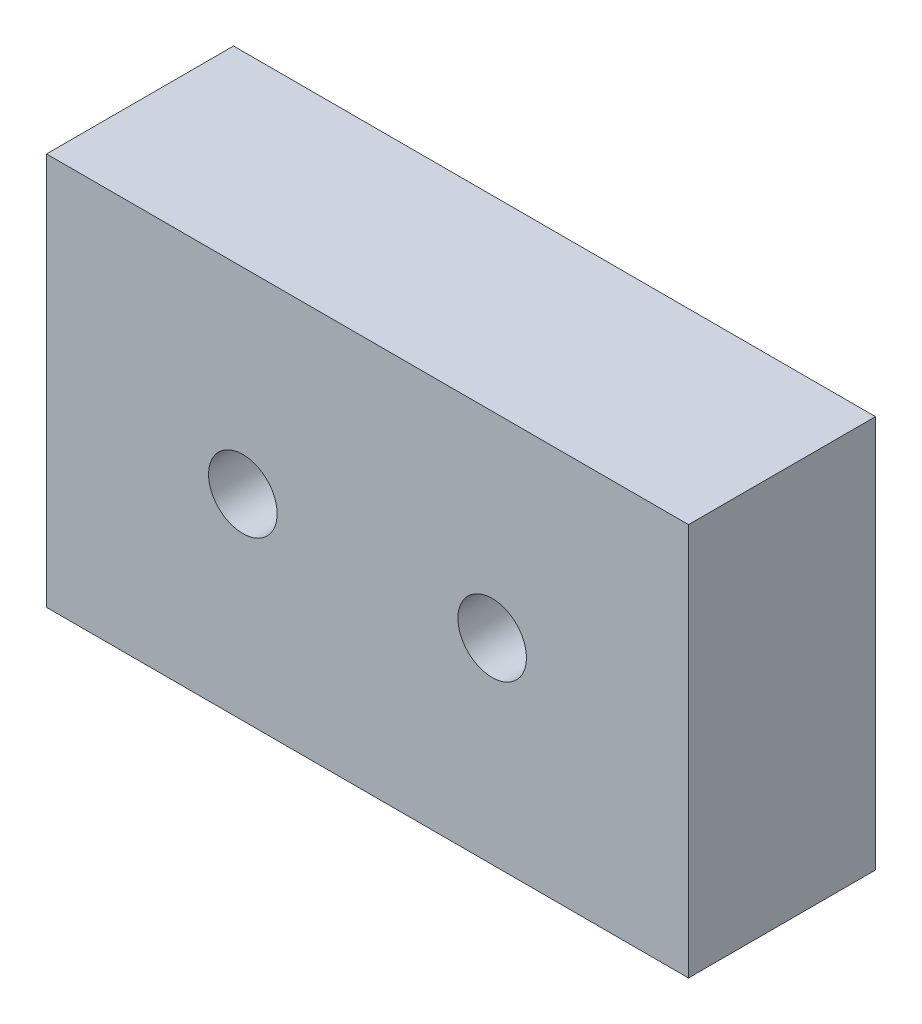
ISO-10303-21;
HEADER;
FILE_DESCRIPTION(('STEP AP214'),'2;1');
FILE_NAME('part.step','',(''),(''),'','','');
FILE_SCHEMA(('AUTOMOTIVE_DESIGN { 1 0 10303 214 1 1 1 1 }'));
ENDSEC;
DATA;
#1=APPLICATION_CONTEXT('core data for automotive mechanical design processes');
#2=APPLICATION_PROTOCOL_DEFINITION('international standard','automotive_design',2000,#1);
#3=PRODUCT_CONTEXT('',#1,'mechanical');
#4=PRODUCT('Part','Part','',(#3));
#5=PRODUCT_RELATED_PRODUCT_CATEGORY('part','',(#4));
#6=PRODUCT_DEFINITION_FORMATION('','',#4);
#7=PRODUCT_DEFINITION_CONTEXT('part definition',#1,'design');
#8=PRODUCT_DEFINITION('design','',#6,#7);
#9=PRODUCT_DEFINITION_SHAPE('','',#8);
#10=(LENGTH_UNIT() NAMED_UNIT(*) SI_UNIT(.MILLI.,.METRE.));
#11=(NAMED_UNIT(*) PLANE_ANGLE_UNIT() SI_UNIT($,.RADIAN.));
#12=(NAMED_UNIT(*) SI_UNIT($,.STERADIAN.) SOLID_ANGLE_UNIT());
#13=UNCERTAINTY_MEASURE_WITH_UNIT(LENGTH_MEASURE(1.E-05),#10,'distance_accuracy_value','');
#14=(GEOMETRIC_REPRESENTATION_CONTEXT(3) GLOBAL_UNCERTAINTY_ASSIGNED_CONTEXT((#13)) GLOBAL_UNIT_ASSIGNED_CONTEXT((#10,
#11,#12)) REPRESENTATION_CONTEXT('',''));
#15=CARTESIAN_POINT('',(0.,0.,0.));
#16=DIRECTION('',(0.,0.,1.));
#17=DIRECTION('',(1.,0.,0.));
#18=AXIS2_PLACEMENT_3D('',#15,#16,#17);
#19=CARTESIAN_POINT('',(20.6,12.6,12.));
#20=DIRECTION('',(-1.,0.,0.));
#21=DIRECTION('',(0.,-1.,0.));
#22=AXIS2_PLACEMENT_3D('',#19,#20,#21);
#23=PLANE('',#22);
#24=DIRECTION('',(0.,1.,0.));
#25=VECTOR('',#24,1.);
#26=CARTESIAN_POINT('',(20.6,12.6,0.));
#27=LINE('',#26,#25);
#28=CARTESIAN_POINT('',(20.6,-12.6,0.));
#29=VERTEX_POINT('',#28);
#30=CARTESIAN_POINT('',(20.6,12.6,0.));
#31=VERTEX_POINT('',#30);
#32=EDGE_CURVE('E95',#29,#31,#27,.T.);
#33=ORIENTED_EDGE('',*,*,#32,.T.);
#34=DIRECTION('',(0.,0.,-1.));
#35=VECTOR('',#34,1.);
#36=CARTESIAN_POINT('',(20.6,12.6,12.));
#37=LINE('',#36,#35);
#38=CARTESIAN_POINT('',(20.6,12.6,12.));
#39=VERTEX_POINT('',#38);
#40=EDGE_CURVE('E11',#39,#31,#37,.T.);
#41=ORIENTED_EDGE('',*,*,#40,.F.);
#42=DIRECTION('',(0.,1.,0.));
#43=VECTOR('',#42,1.);
#44=CARTESIAN_POINT('',(20.6,12.6,12.));
#45=LINE('',#44,#43);
#46=CARTESIAN_POINT('',(20.6,-12.6,12.));
#47=VERTEX_POINT('',#46);
#48=EDGE_CURVE('E83',#47,#39,#45,.T.);
#49=ORIENTED_EDGE('',*,*,#48,.F.);
#50=DIRECTION('',(0.,0.,-1.));
#51=VECTOR('',#50,1.);
#52=CARTESIAN_POINT('',(20.6,-12.6,12.));
#53=LINE('',#52,#51);
#54=EDGE_CURVE('E91',#47,#29,#53,.T.);
#55=ORIENTED_EDGE('',*,*,#54,.T.);
#56=EDGE_LOOP('',(#33,#41,#49,#55));
#57=FACE_BOUND('',#56,.T.);
#58=ADVANCED_FACE('F32',(#57),#23,.F.);
#59=CARTESIAN_POINT('',(-20.6,12.6,12.));
#60=DIRECTION('',(0.,-1.,0.));
#61=DIRECTION('',(0.,0.,-1.));
#62=AXIS2_PLACEMENT_3D('',#59,#60,#61);
#63=PLANE('',#62);
#64=DIRECTION('',(-1.,0.,0.));
#65=VECTOR('',#64,1.);
#66=CARTESIAN_POINT('',(-20.6,12.6,0.));
#67=LINE('',#66,#65);
#68=CARTESIAN_POINT('',(-20.6,12.6,0.));
#69=VERTEX_POINT('',#68);
#70=EDGE_CURVE('E87',#31,#69,#67,.T.);
#71=ORIENTED_EDGE('',*,*,#70,.T.);
#72=DIRECTION('',(0.,0.,-1.));
#73=VECTOR('',#72,1.);
#74=CARTESIAN_POINT('',(-20.6,12.6,12.));
#75=LINE('',#74,#73);
#76=CARTESIAN_POINT('',(-20.6,12.6,12.));
#77=VERTEX_POINT('',#76);
#78=EDGE_CURVE('E40',#77,#69,#75,.T.);
#79=ORIENTED_EDGE('',*,*,#78,.F.);
#80=DIRECTION('',(-1.,0.,0.));
#81=VECTOR('',#80,1.);
#82=CARTESIAN_POINT('',(-20.6,12.6,12.));
#83=LINE('',#82,#81);
#84=EDGE_CURVE('E78',#39,#77,#83,.T.);
#85=ORIENTED_EDGE('',*,*,#84,.F.);
#86=ORIENTED_EDGE('',*,*,#40,.T.);
#87=EDGE_LOOP('',(#71,#79,#85,#86));
#88=FACE_BOUND('',#87,.T.);
#89=ADVANCED_FACE('F86',(#88),#63,.F.);
#90=CARTESIAN_POINT('',(-20.6,12.6,12.));
#91=DIRECTION('',(1.,0.,0.));
#92=DIRECTION('',(0.,1.,0.));
#93=AXIS2_PLACEMENT_3D('',#90,#91,#92);
#94=PLANE('',#93);
#95=DIRECTION('',(0.,-1.,0.));
#96=VECTOR('',#95,1.);
#97=CARTESIAN_POINT('',(-20.6,12.6,0.));
#98=LINE('',#97,#96);
#99=CARTESIAN_POINT('',(-20.6,-12.6,0.));
#100=VERTEX_POINT('',#99);
#101=EDGE_CURVE('E65',#69,#100,#98,.T.);
#102=ORIENTED_EDGE('',*,*,#101,.T.);
#103=DIRECTION('',(0.,0.,-1.));
#104=VECTOR('',#103,1.);
#105=CARTESIAN_POINT('',(-20.6,-12.6,12.));
#106=LINE('',#105,#104);
#107=CARTESIAN_POINT('',(-20.6,-12.6,12.));
#108=VERTEX_POINT('',#107);
#109=EDGE_CURVE('E88',#108,#100,#106,.T.);
#110=ORIENTED_EDGE('',*,*,#109,.F.);
#111=DIRECTION('',(0.,-1.,0.));
#112=VECTOR('',#111,1.);
#113=CARTESIAN_POINT('',(-20.6,12.6,12.));
#114=LINE('',#113,#112);
#115=EDGE_CURVE('E81',#77,#108,#114,.T.);
#116=ORIENTED_EDGE('',*,*,#115,.F.);
#117=ORIENTED_EDGE('',*,*,#78,.T.);
#118=EDGE_LOOP('',(#102,#110,#116,#117));
#119=FACE_BOUND('',#118,.T.);
#120=ADVANCED_FACE('F89',(#119),#94,.F.);
#121=CARTESIAN_POINT('',(-20.6,-12.6,12.));
#122=DIRECTION('',(0.,1.,0.));
#123=DIRECTION('',(0.,0.,1.));
#124=AXIS2_PLACEMENT_3D('',#121,#122,#123);
#125=PLANE('',#124);
#126=DIRECTION('',(1.,0.,0.));
#127=VECTOR('',#126,1.);
#128=CARTESIAN_POINT('',(-20.6,-12.6,0.));
#129=LINE('',#128,#127);
#130=EDGE_CURVE('E71',#100,#29,#129,.T.);
#131=ORIENTED_EDGE('',*,*,#130,.T.);
#132=ORIENTED_EDGE('',*,*,#54,.F.);
#133=DIRECTION('',(1.,0.,0.));
#134=VECTOR('',#133,1.);
#135=CARTESIAN_POINT('',(-20.6,-12.6,12.));
#136=LINE('',#135,#134);
#137=EDGE_CURVE('E48',#108,#47,#136,.T.);
#138=ORIENTED_EDGE('',*,*,#137,.F.);
#139=ORIENTED_EDGE('',*,*,#109,.T.);
#140=EDGE_LOOP('',(#131,#132,#138,#139));
#141=FACE_BOUND('',#140,.T.);
#142=ADVANCED_FACE('F103',(#141),#125,.F.);
#143=CARTESIAN_POINT('',(0.,0.,12.));
#144=DIRECTION('',(0.,0.,1.));
#145=DIRECTION('',(1.,0.,0.));
#146=AXIS2_PLACEMENT_3D('',#143,#144,#145);
#147=PLANE('',#146);
#148=CARTESIAN_POINT('',(8.,0.,12.));
#149=DIRECTION('',(0.,0.,1.));
#150=DIRECTION('',(1.,0.,0.));
#151=AXIS2_PLACEMENT_3D('',#148,#149,#150);
#152=CIRCLE('',#151,2.2);
#153=CARTESIAN_POINT('',(10.2,0.,12.));
#154=VERTEX_POINT('',#153);
#155=EDGE_CURVE('E98',#154,#154,#152,.T.);
#156=ORIENTED_EDGE('',*,*,#155,.F.);
#157=EDGE_LOOP('',(#156));
#158=FACE_BOUND('',#157,.T.);
#159=CARTESIAN_POINT('',(-8.,0.,12.));
#160=DIRECTION('',(0.,0.,1.));
#161=DIRECTION('',(1.,0.,0.));
#162=AXIS2_PLACEMENT_3D('',#159,#160,#161);
#163=CIRCLE('',#162,2.2);
#164=CARTESIAN_POINT('',(-5.8,0.,12.));
#165=VERTEX_POINT('',#164);
#166=EDGE_CURVE('E112',#165,#165,#163,.T.);
#167=ORIENTED_EDGE('',*,*,#166,.F.);
#168=EDGE_LOOP('',(#167));
#169=FACE_BOUND('',#168,.T.);
#170=ORIENTED_EDGE('',*,*,#48,.T.);
#171=ORIENTED_EDGE('',*,*,#84,.T.);
#172=ORIENTED_EDGE('',*,*,#115,.T.);
#173=ORIENTED_EDGE('',*,*,#137,.T.);
#174=EDGE_LOOP('',(#170,#171,#172,#173));
#175=FACE_BOUND('',#174,.T.);
#176=ADVANCED_FACE('F79',(#158,#169,#175),#147,.T.);
#177=CARTESIAN_POINT('',(0.,0.,0.));
#178=DIRECTION('',(0.,0.,1.));
#179=DIRECTION('',(1.,0.,0.));
#180=AXIS2_PLACEMENT_3D('',#177,#178,#179);
#181=PLANE('',#180);
#182=CARTESIAN_POINT('',(8.,0.,0.));
#183=DIRECTION('',(0.,0.,1.));
#184=DIRECTION('',(1.,0.,0.));
#185=AXIS2_PLACEMENT_3D('',#182,#183,#184);
#186=CIRCLE('',#185,2.2);
#187=CARTESIAN_POINT('',(10.2,0.,0.));
#188=VERTEX_POINT('',#187);
#189=EDGE_CURVE('E115',#188,#188,#186,.T.);
#190=ORIENTED_EDGE('',*,*,#189,.T.);
#191=EDGE_LOOP('',(#190));
#192=FACE_BOUND('',#191,.T.);
#193=CARTESIAN_POINT('',(-8.,0.,0.));
#194=DIRECTION('',(0.,0.,1.));
#195=DIRECTION('',(1.,0.,0.));
#196=AXIS2_PLACEMENT_3D('',#193,#194,#195);
#197=CIRCLE('',#196,2.2);
#198=CARTESIAN_POINT('',(-5.8,0.,0.));
#199=VERTEX_POINT('',#198);
#200=EDGE_CURVE('E109',#199,#199,#197,.T.);
#201=ORIENTED_EDGE('',*,*,#200,.T.);
#202=EDGE_LOOP('',(#201));
#203=FACE_BOUND('',#202,.T.);
#204=ORIENTED_EDGE('',*,*,#32,.F.);
#205=ORIENTED_EDGE('',*,*,#130,.F.);
#206=ORIENTED_EDGE('',*,*,#101,.F.);
#207=ORIENTED_EDGE('',*,*,#70,.F.);
#208=EDGE_LOOP('',(#204,#205,#206,#207));
#209=FACE_BOUND('',#208,.T.);
#210=ADVANCED_FACE('F106',(#192,#203,#209),#181,.F.);
#211=CARTESIAN_POINT('',(-8.,0.,12.));
#212=DIRECTION('',(0.,0.,-1.));
#213=DIRECTION('',(-1.,0.,0.));
#214=AXIS2_PLACEMENT_3D('',#211,#212,#213);
#215=CYLINDRICAL_SURFACE('',#214,2.2);
#216=ORIENTED_EDGE('',*,*,#166,.T.);
#217=EDGE_LOOP('',(#216));
#218=FACE_BOUND('',#217,.T.);
#219=ORIENTED_EDGE('',*,*,#200,.F.);
#220=EDGE_LOOP('',(#219));
#221=FACE_BOUND('',#220,.T.);
#222=ADVANCED_FACE('F129',(#218,#221),#215,.F.);
#223=CARTESIAN_POINT('',(8.,0.,12.));
#224=DIRECTION('',(0.,0.,-1.));
#225=DIRECTION('',(-1.,0.,0.));
#226=AXIS2_PLACEMENT_3D('',#223,#224,#225);
#227=CYLINDRICAL_SURFACE('',#226,2.2);
#228=ORIENTED_EDGE('',*,*,#155,.T.);
#229=EDGE_LOOP('',(#228));
#230=FACE_BOUND('',#229,.T.);
#231=ORIENTED_EDGE('',*,*,#189,.F.);
#232=EDGE_LOOP('',(#231));
#233=FACE_BOUND('',#232,.T.);
#234=ADVANCED_FACE('F121',(#230,#233),#227,.F.);
#235=CLOSED_SHELL('',(#58,#89,#120,#142,#176,#210,#222,#234));
#236=MANIFOLD_SOLID_BREP('B2',#235);
#237=ADVANCED_BREP_SHAPE_REPRESENTATION('',(#18,#236),#14);
#238=SHAPE_DEFINITION_REPRESENTATION(#9,#237);
ENDSEC;
END-ISO-10303-21;
